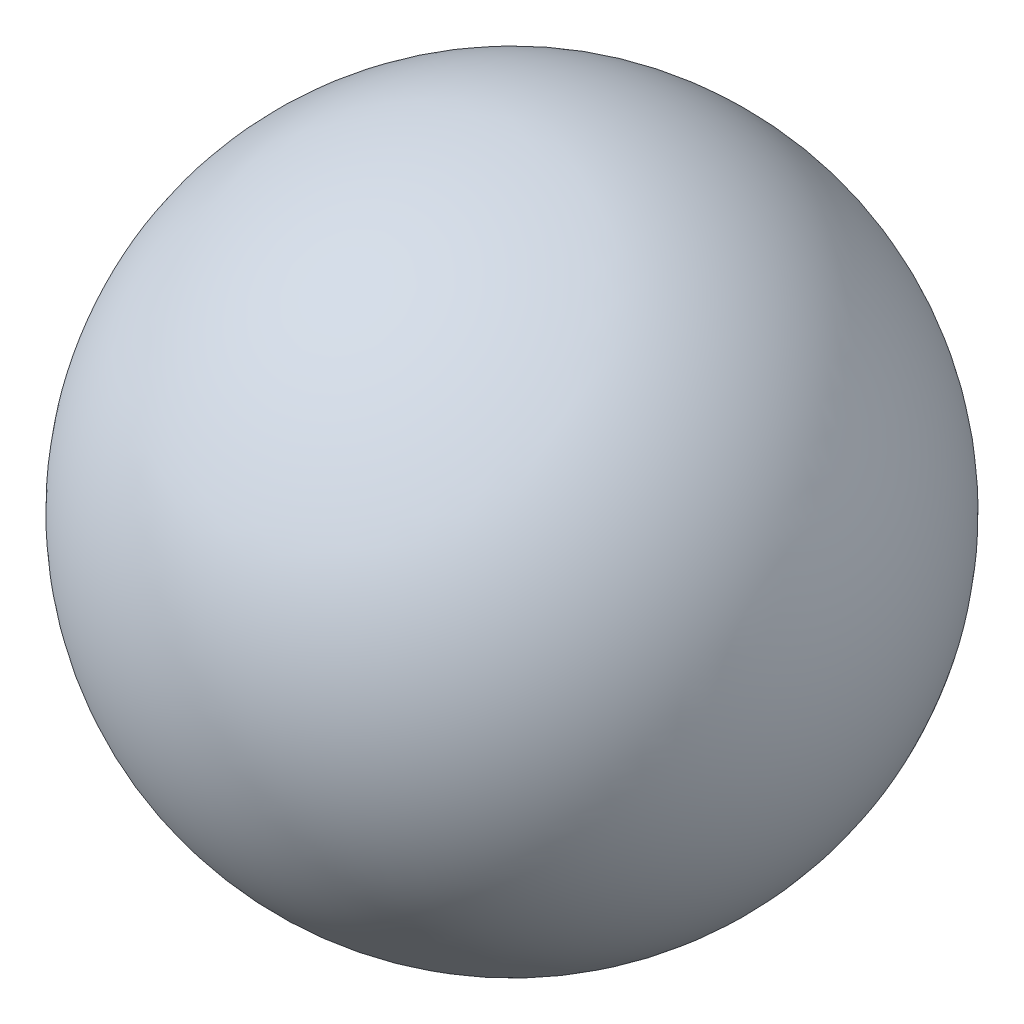
ISO-10303-21;
HEADER;
FILE_DESCRIPTION(('STEP AP214'),'2;1');
FILE_NAME('part.step','',(''),(''),'','','');
FILE_SCHEMA(('AUTOMOTIVE_DESIGN { 1 0 10303 214 1 1 1 1 }'));
ENDSEC;
DATA;
#1=APPLICATION_CONTEXT('core data for automotive mechanical design processes');
#2=APPLICATION_PROTOCOL_DEFINITION('international standard','automotive_design',2000,#1);
#3=PRODUCT_CONTEXT('',#1,'mechanical');
#4=PRODUCT('Part','Part','',(#3));
#5=PRODUCT_RELATED_PRODUCT_CATEGORY('part','',(#4));
#6=PRODUCT_DEFINITION_FORMATION('','',#4);
#7=PRODUCT_DEFINITION_CONTEXT('part definition',#1,'design');
#8=PRODUCT_DEFINITION('design','',#6,#7);
#9=PRODUCT_DEFINITION_SHAPE('','',#8);
#10=(LENGTH_UNIT() NAMED_UNIT(*) SI_UNIT(.MILLI.,.METRE.));
#11=(NAMED_UNIT(*) PLANE_ANGLE_UNIT() SI_UNIT($,.RADIAN.));
#12=(NAMED_UNIT(*) SI_UNIT($,.STERADIAN.) SOLID_ANGLE_UNIT());
#13=UNCERTAINTY_MEASURE_WITH_UNIT(LENGTH_MEASURE(1.E-05),#10,'distance_accuracy_value','');
#14=(GEOMETRIC_REPRESENTATION_CONTEXT(3) GLOBAL_UNCERTAINTY_ASSIGNED_CONTEXT((#13)) GLOBAL_UNIT_ASSIGNED_CONTEXT((#10,
#11,#12)) REPRESENTATION_CONTEXT('',''));
#15=CARTESIAN_POINT('',(0.,0.,0.));
#16=DIRECTION('',(0.,0.,1.));
#17=DIRECTION('',(1.,0.,0.));
#18=AXIS2_PLACEMENT_3D('',#15,#16,#17);
#19=CARTESIAN_POINT('',(0.,0.,0.));
#20=DIRECTION('',(-0.996693574295643,0.,0.0812521935567029));
#21=DIRECTION('',(-0.0812521935567029,0.,-0.996693574295643));
#22=AXIS2_PLACEMENT_3D('',#19,#20,#21);
#23=SPHERICAL_SURFACE('',#22,990.6);
#24=CARTESIAN_POINT('',(-987.324654697264,0.,80.4884229372699));
#25=VERTEX_POINT('',#24);
#26=VERTEX_LOOP('',#25);
#27=FACE_BOUND('',#26,.T.);
#28=ADVANCED_FACE('F32',(#27),#23,.T.);
#29=CLOSED_SHELL('',(#28));
#30=CARTESIAN_POINT('',(0.,0.,0.));
#31=DIRECTION('',(-0.996693574295643,0.,0.0812521935567029));
#32=DIRECTION('',(0.0812521935567029,0.,0.996693574295643));
#33=AXIS2_PLACEMENT_3D('',#30,#31,#32);
#34=SPHERICAL_SURFACE('',#33,984.25);
#35=CARTESIAN_POINT('',(-980.995650500486,0.,79.9724715081848));
#36=VERTEX_POINT('',#35);
#37=VERTEX_LOOP('',#36);
#38=FACE_BOUND('',#37,.T.);
#39=ADVANCED_FACE('F45',(#38),#34,.F.);
#40=CLOSED_SHELL('',(#39));
#41=ORIENTED_CLOSED_SHELL('',*,#40,.T.);
#42=BREP_WITH_VOIDS('B2',#29,(#41));
#43=ADVANCED_BREP_SHAPE_REPRESENTATION('',(#18,#42),#14);
#44=SHAPE_DEFINITION_REPRESENTATION(#9,#43);
ENDSEC;
END-ISO-10303-21;
